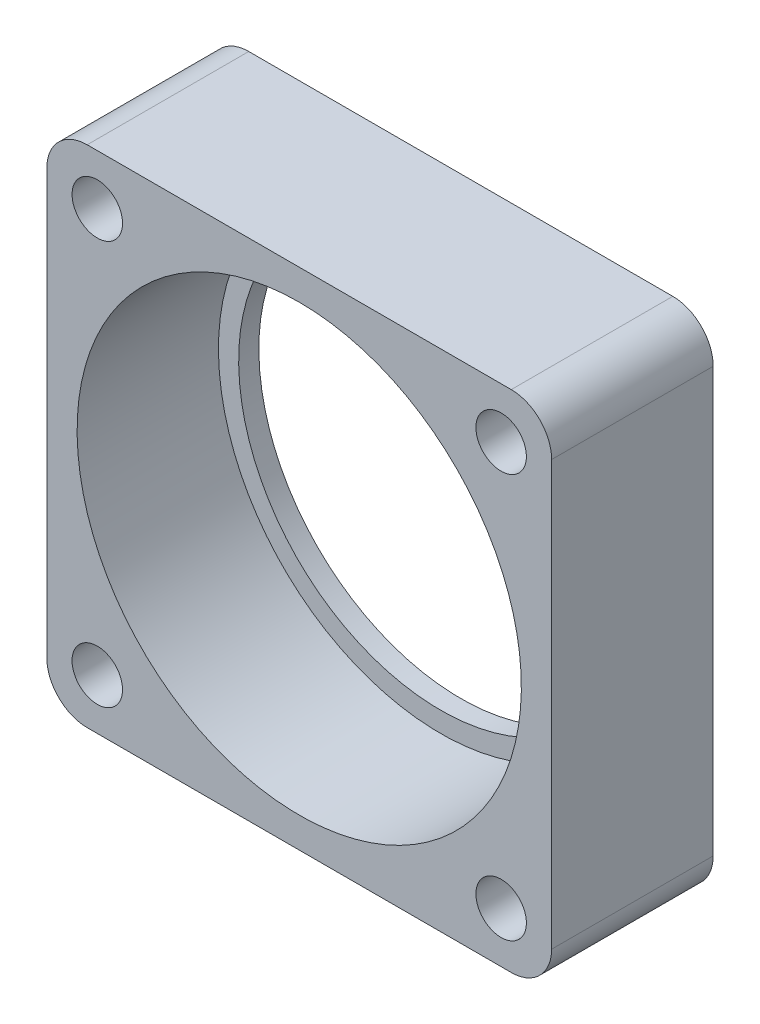
ISO-10303-21;
HEADER;
FILE_DESCRIPTION(('STEP AP214'),'2;1');
FILE_NAME('part.step','',(''),(''),'','','');
FILE_SCHEMA(('AUTOMOTIVE_DESIGN { 1 0 10303 214 1 1 1 1 }'));
ENDSEC;
DATA;
#1=APPLICATION_CONTEXT('core data for automotive mechanical design processes');
#2=APPLICATION_PROTOCOL_DEFINITION('international standard','automotive_design',2000,#1);
#3=PRODUCT_CONTEXT('',#1,'mechanical');
#4=PRODUCT('Part','Part','',(#3));
#5=PRODUCT_RELATED_PRODUCT_CATEGORY('part','',(#4));
#6=PRODUCT_DEFINITION_FORMATION('','',#4);
#7=PRODUCT_DEFINITION_CONTEXT('part definition',#1,'design');
#8=PRODUCT_DEFINITION('design','',#6,#7);
#9=PRODUCT_DEFINITION_SHAPE('','',#8);
#10=(LENGTH_UNIT() NAMED_UNIT(*) SI_UNIT(.MILLI.,.METRE.));
#11=(NAMED_UNIT(*) PLANE_ANGLE_UNIT() SI_UNIT($,.RADIAN.));
#12=(NAMED_UNIT(*) SI_UNIT($,.STERADIAN.) SOLID_ANGLE_UNIT());
#13=UNCERTAINTY_MEASURE_WITH_UNIT(LENGTH_MEASURE(1.E-05),#10,'distance_accuracy_value','');
#14=(GEOMETRIC_REPRESENTATION_CONTEXT(3) GLOBAL_UNCERTAINTY_ASSIGNED_CONTEXT((#13)) GLOBAL_UNIT_ASSIGNED_CONTEXT((#10,
#11,#12)) REPRESENTATION_CONTEXT('',''));
#15=CARTESIAN_POINT('',(0.,0.,0.));
#16=DIRECTION('',(0.,0.,1.));
#17=DIRECTION('',(1.,0.,0.));
#18=AXIS2_PLACEMENT_3D('',#15,#16,#17);
#19=CARTESIAN_POINT('',(0.,0.,8.));
#20=DIRECTION('',(0.,0.,1.));
#21=DIRECTION('',(1.,0.,0.));
#22=AXIS2_PLACEMENT_3D('',#19,#20,#21);
#23=PLANE('',#22);
#24=CARTESIAN_POINT('',(0.,0.,8.));
#25=DIRECTION('',(0.,0.,-1.));
#26=DIRECTION('',(0.,1.,0.));
#27=AXIS2_PLACEMENT_3D('',#24,#25,#26);
#28=CIRCLE('',#27,11.);
#29=CARTESIAN_POINT('',(0.,11.,8.));
#30=VERTEX_POINT('',#29);
#31=EDGE_CURVE('E210',#30,#30,#28,.T.);
#32=ORIENTED_EDGE('',*,*,#31,.T.);
#33=EDGE_LOOP('',(#32));
#34=FACE_BOUND('',#33,.T.);
#35=CARTESIAN_POINT('',(10.,-10.,8.));
#36=DIRECTION('',(0.,0.,1.));
#37=DIRECTION('',(1.,0.,0.));
#38=AXIS2_PLACEMENT_3D('',#35,#36,#37);
#39=CIRCLE('',#38,1.25);
#40=CARTESIAN_POINT('',(11.25,-10.,8.));
#41=VERTEX_POINT('',#40);
#42=EDGE_CURVE('E187',#41,#41,#39,.T.);
#43=ORIENTED_EDGE('',*,*,#42,.F.);
#44=EDGE_LOOP('',(#43));
#45=FACE_BOUND('',#44,.T.);
#46=CARTESIAN_POINT('',(-9.99999999999999,10.,8.));
#47=DIRECTION('',(0.,0.,1.));
#48=DIRECTION('',(1.,0.,0.));
#49=AXIS2_PLACEMENT_3D('',#46,#47,#48);
#50=CIRCLE('',#49,1.25);
#51=CARTESIAN_POINT('',(-8.74999999999999,10.,8.));
#52=VERTEX_POINT('',#51);
#53=EDGE_CURVE('E129',#52,#52,#50,.T.);
#54=ORIENTED_EDGE('',*,*,#53,.F.);
#55=EDGE_LOOP('',(#54));
#56=FACE_BOUND('',#55,.T.);
#57=DIRECTION('',(-1.,0.,0.));
#58=VECTOR('',#57,1.);
#59=CARTESIAN_POINT('',(-12.5,12.5,8.));
#60=LINE('',#59,#58);
#61=CARTESIAN_POINT('',(10.5,12.5,8.));
#62=VERTEX_POINT('',#61);
#63=CARTESIAN_POINT('',(-10.5,12.5,8.));
#64=VERTEX_POINT('',#63);
#65=EDGE_CURVE('E138',#62,#64,#60,.T.);
#66=ORIENTED_EDGE('',*,*,#65,.T.);
#67=CARTESIAN_POINT('',(-10.5,10.5,8.));
#68=DIRECTION('',(0.,0.,1.));
#69=DIRECTION('',(1.,0.,0.));
#70=AXIS2_PLACEMENT_3D('',#67,#68,#69);
#71=CIRCLE('',#70,2.);
#72=CARTESIAN_POINT('',(-12.5,10.5,8.));
#73=VERTEX_POINT('',#72);
#74=EDGE_CURVE('E156',#64,#73,#71,.T.);
#75=ORIENTED_EDGE('',*,*,#74,.T.);
#76=DIRECTION('',(0.,-1.,0.));
#77=VECTOR('',#76,1.);
#78=CARTESIAN_POINT('',(-12.5,12.5,8.));
#79=LINE('',#78,#77);
#80=CARTESIAN_POINT('',(-12.5,-10.5,8.));
#81=VERTEX_POINT('',#80);
#82=EDGE_CURVE('E120',#73,#81,#79,.T.);
#83=ORIENTED_EDGE('',*,*,#82,.T.);
#84=CARTESIAN_POINT('',(-10.5,-10.5,8.));
#85=DIRECTION('',(0.,0.,1.));
#86=DIRECTION('',(1.,0.,0.));
#87=AXIS2_PLACEMENT_3D('',#84,#85,#86);
#88=CIRCLE('',#87,2.);
#89=CARTESIAN_POINT('',(-10.5,-12.5,8.));
#90=VERTEX_POINT('',#89);
#91=EDGE_CURVE('E153',#81,#90,#88,.T.);
#92=ORIENTED_EDGE('',*,*,#91,.T.);
#93=DIRECTION('',(1.,0.,0.));
#94=VECTOR('',#93,1.);
#95=CARTESIAN_POINT('',(-12.5,-12.5,8.));
#96=LINE('',#95,#94);
#97=CARTESIAN_POINT('',(10.5,-12.5,8.));
#98=VERTEX_POINT('',#97);
#99=EDGE_CURVE('E167',#90,#98,#96,.T.);
#100=ORIENTED_EDGE('',*,*,#99,.T.);
#101=CARTESIAN_POINT('',(10.5,-10.5,8.));
#102=DIRECTION('',(0.,0.,1.));
#103=DIRECTION('',(1.,0.,0.));
#104=AXIS2_PLACEMENT_3D('',#101,#102,#103);
#105=CIRCLE('',#104,2.);
#106=CARTESIAN_POINT('',(12.5,-10.5,8.));
#107=VERTEX_POINT('',#106);
#108=EDGE_CURVE('E56',#98,#107,#105,.T.);
#109=ORIENTED_EDGE('',*,*,#108,.T.);
#110=DIRECTION('',(0.,1.,0.));
#111=VECTOR('',#110,1.);
#112=CARTESIAN_POINT('',(12.5,12.5,8.));
#113=LINE('',#112,#111);
#114=CARTESIAN_POINT('',(12.5,10.5,8.));
#115=VERTEX_POINT('',#114);
#116=EDGE_CURVE('E175',#107,#115,#113,.T.);
#117=ORIENTED_EDGE('',*,*,#116,.T.);
#118=CARTESIAN_POINT('',(10.5,10.5,8.));
#119=DIRECTION('',(0.,0.,1.));
#120=DIRECTION('',(1.,0.,0.));
#121=AXIS2_PLACEMENT_3D('',#118,#119,#120);
#122=CIRCLE('',#121,2.);
#123=EDGE_CURVE('E151',#115,#62,#122,.T.);
#124=ORIENTED_EDGE('',*,*,#123,.T.);
#125=EDGE_LOOP('',(#66,#75,#83,#92,#100,#109,#117,#124));
#126=FACE_BOUND('',#125,.T.);
#127=CARTESIAN_POINT('',(10.,10.,8.));
#128=DIRECTION('',(0.,0.,1.));
#129=DIRECTION('',(-1.,0.,0.));
#130=AXIS2_PLACEMENT_3D('',#127,#128,#129);
#131=CIRCLE('',#130,1.25);
#132=CARTESIAN_POINT('',(8.75000000000001,10.,8.));
#133=VERTEX_POINT('',#132);
#134=EDGE_CURVE('E182',#133,#133,#131,.T.);
#135=ORIENTED_EDGE('',*,*,#134,.F.);
#136=EDGE_LOOP('',(#135));
#137=FACE_BOUND('',#136,.T.);
#138=CARTESIAN_POINT('',(-10.,-10.,8.));
#139=DIRECTION('',(0.,0.,1.));
#140=DIRECTION('',(-1.,0.,0.));
#141=AXIS2_PLACEMENT_3D('',#138,#139,#140);
#142=CIRCLE('',#141,1.25);
#143=CARTESIAN_POINT('',(-11.25,-10.,8.));
#144=VERTEX_POINT('',#143);
#145=EDGE_CURVE('E193',#144,#144,#142,.T.);
#146=ORIENTED_EDGE('',*,*,#145,.F.);
#147=EDGE_LOOP('',(#146));
#148=FACE_BOUND('',#147,.T.);
#149=ADVANCED_FACE('F34',(#34,#45,#56,#126,#137,#148),#23,.T.);
#150=CARTESIAN_POINT('',(0.,0.,0.));
#151=DIRECTION('',(0.,0.,1.));
#152=DIRECTION('',(1.,0.,0.));
#153=AXIS2_PLACEMENT_3D('',#150,#151,#152);
#154=PLANE('',#153);
#155=CARTESIAN_POINT('',(0.,0.,0.));
#156=DIRECTION('',(0.,0.,-1.));
#157=DIRECTION('',(0.,1.,0.));
#158=AXIS2_PLACEMENT_3D('',#155,#156,#157);
#159=CIRCLE('',#158,9.99999999999999);
#160=CARTESIAN_POINT('',(0.,10.,0.));
#161=VERTEX_POINT('',#160);
#162=EDGE_CURVE('E199',#161,#161,#159,.T.);
#163=ORIENTED_EDGE('',*,*,#162,.F.);
#164=EDGE_LOOP('',(#163));
#165=FACE_BOUND('',#164,.T.);
#166=CARTESIAN_POINT('',(10.,-10.,0.));
#167=DIRECTION('',(0.,0.,1.));
#168=DIRECTION('',(1.,0.,0.));
#169=AXIS2_PLACEMENT_3D('',#166,#167,#168);
#170=CIRCLE('',#169,1.25);
#171=CARTESIAN_POINT('',(11.25,-10.,0.));
#172=VERTEX_POINT('',#171);
#173=EDGE_CURVE('E190',#172,#172,#170,.T.);
#174=ORIENTED_EDGE('',*,*,#173,.T.);
#175=EDGE_LOOP('',(#174));
#176=FACE_BOUND('',#175,.T.);
#177=CARTESIAN_POINT('',(-9.99999999999999,10.,0.));
#178=DIRECTION('',(0.,0.,1.));
#179=DIRECTION('',(1.,0.,0.));
#180=AXIS2_PLACEMENT_3D('',#177,#178,#179);
#181=CIRCLE('',#180,1.25);
#182=CARTESIAN_POINT('',(-8.74999999999999,10.,0.));
#183=VERTEX_POINT('',#182);
#184=EDGE_CURVE('E135',#183,#183,#181,.T.);
#185=ORIENTED_EDGE('',*,*,#184,.T.);
#186=EDGE_LOOP('',(#185));
#187=FACE_BOUND('',#186,.T.);
#188=DIRECTION('',(0.,-1.,0.));
#189=VECTOR('',#188,1.);
#190=CARTESIAN_POINT('',(-12.5,12.5,0.));
#191=LINE('',#190,#189);
#192=CARTESIAN_POINT('',(-12.5,10.5,0.));
#193=VERTEX_POINT('',#192);
#194=CARTESIAN_POINT('',(-12.5,-10.5,0.));
#195=VERTEX_POINT('',#194);
#196=EDGE_CURVE('E117',#193,#195,#191,.T.);
#197=ORIENTED_EDGE('',*,*,#196,.F.);
#198=CARTESIAN_POINT('',(-10.5,10.5,0.));
#199=DIRECTION('',(0.,0.,1.));
#200=DIRECTION('',(1.,0.,0.));
#201=AXIS2_PLACEMENT_3D('',#198,#199,#200);
#202=CIRCLE('',#201,2.);
#203=CARTESIAN_POINT('',(-10.5,12.5,0.));
#204=VERTEX_POINT('',#203);
#205=EDGE_CURVE('E100',#193,#204,#202,.F.);
#206=ORIENTED_EDGE('',*,*,#205,.T.);
#207=DIRECTION('',(-1.,0.,0.));
#208=VECTOR('',#207,1.);
#209=CARTESIAN_POINT('',(-12.5,12.5,0.));
#210=LINE('',#209,#208);
#211=CARTESIAN_POINT('',(10.5,12.5,0.));
#212=VERTEX_POINT('',#211);
#213=EDGE_CURVE('E142',#212,#204,#210,.T.);
#214=ORIENTED_EDGE('',*,*,#213,.F.);
#215=CARTESIAN_POINT('',(10.5,10.5,0.));
#216=DIRECTION('',(0.,0.,1.));
#217=DIRECTION('',(1.,0.,0.));
#218=AXIS2_PLACEMENT_3D('',#215,#216,#217);
#219=CIRCLE('',#218,2.);
#220=CARTESIAN_POINT('',(12.5,10.5,0.));
#221=VERTEX_POINT('',#220);
#222=EDGE_CURVE('E121',#212,#221,#219,.F.);
#223=ORIENTED_EDGE('',*,*,#222,.T.);
#224=DIRECTION('',(0.,1.,0.));
#225=VECTOR('',#224,1.);
#226=CARTESIAN_POINT('',(12.5,12.5,0.));
#227=LINE('',#226,#225);
#228=CARTESIAN_POINT('',(12.5,-10.5,0.));
#229=VERTEX_POINT('',#228);
#230=EDGE_CURVE('E132',#229,#221,#227,.T.);
#231=ORIENTED_EDGE('',*,*,#230,.F.);
#232=CARTESIAN_POINT('',(10.5,-10.5,0.));
#233=DIRECTION('',(0.,0.,1.));
#234=DIRECTION('',(1.,0.,0.));
#235=AXIS2_PLACEMENT_3D('',#232,#233,#234);
#236=CIRCLE('',#235,2.);
#237=CARTESIAN_POINT('',(10.5,-12.5,0.));
#238=VERTEX_POINT('',#237);
#239=EDGE_CURVE('E111',#229,#238,#236,.F.);
#240=ORIENTED_EDGE('',*,*,#239,.T.);
#241=DIRECTION('',(1.,0.,0.));
#242=VECTOR('',#241,1.);
#243=CARTESIAN_POINT('',(-12.5,-12.5,0.));
#244=LINE('',#243,#242);
#245=CARTESIAN_POINT('',(-10.5,-12.5,0.));
#246=VERTEX_POINT('',#245);
#247=EDGE_CURVE('E128',#246,#238,#244,.T.);
#248=ORIENTED_EDGE('',*,*,#247,.F.);
#249=CARTESIAN_POINT('',(-10.5,-10.5,0.));
#250=DIRECTION('',(0.,0.,1.));
#251=DIRECTION('',(1.,0.,0.));
#252=AXIS2_PLACEMENT_3D('',#249,#250,#251);
#253=CIRCLE('',#252,2.);
#254=EDGE_CURVE('E127',#246,#195,#253,.F.);
#255=ORIENTED_EDGE('',*,*,#254,.T.);
#256=EDGE_LOOP('',(#197,#206,#214,#223,#231,#240,#248,#255));
#257=FACE_BOUND('',#256,.T.);
#258=CARTESIAN_POINT('',(10.,10.,0.));
#259=DIRECTION('',(0.,0.,1.));
#260=DIRECTION('',(-1.,0.,0.));
#261=AXIS2_PLACEMENT_3D('',#258,#259,#260);
#262=CIRCLE('',#261,1.25);
#263=CARTESIAN_POINT('',(8.75000000000001,10.,0.));
#264=VERTEX_POINT('',#263);
#265=EDGE_CURVE('E184',#264,#264,#262,.T.);
#266=ORIENTED_EDGE('',*,*,#265,.T.);
#267=EDGE_LOOP('',(#266));
#268=FACE_BOUND('',#267,.T.);
#269=CARTESIAN_POINT('',(-10.,-10.,0.));
#270=DIRECTION('',(0.,0.,1.));
#271=DIRECTION('',(-1.,0.,0.));
#272=AXIS2_PLACEMENT_3D('',#269,#270,#271);
#273=CIRCLE('',#272,1.25);
#274=CARTESIAN_POINT('',(-11.25,-10.,0.));
#275=VERTEX_POINT('',#274);
#276=EDGE_CURVE('E196',#275,#275,#273,.T.);
#277=ORIENTED_EDGE('',*,*,#276,.T.);
#278=EDGE_LOOP('',(#277));
#279=FACE_BOUND('',#278,.T.);
#280=ADVANCED_FACE('F124',(#165,#176,#187,#257,#268,#279),#154,.F.);
#281=CARTESIAN_POINT('',(-12.5,12.5,8.));
#282=DIRECTION('',(1.,0.,0.));
#283=DIRECTION('',(0.,1.,0.));
#284=AXIS2_PLACEMENT_3D('',#281,#282,#283);
#285=PLANE('',#284);
#286=ORIENTED_EDGE('',*,*,#82,.F.);
#287=DIRECTION('',(0.,0.,-1.));
#288=VECTOR('',#287,1.);
#289=CARTESIAN_POINT('',(-12.5,10.5,8.));
#290=LINE('',#289,#288);
#291=EDGE_CURVE('E104',#73,#193,#290,.T.);
#292=ORIENTED_EDGE('',*,*,#291,.T.);
#293=ORIENTED_EDGE('',*,*,#196,.T.);
#294=DIRECTION('',(0.,0.,-1.));
#295=VECTOR('',#294,1.);
#296=CARTESIAN_POINT('',(-12.5,-10.5,8.));
#297=LINE('',#296,#295);
#298=EDGE_CURVE('E122',#195,#81,#297,.F.);
#299=ORIENTED_EDGE('',*,*,#298,.T.);
#300=EDGE_LOOP('',(#286,#292,#293,#299));
#301=FACE_BOUND('',#300,.T.);
#302=ADVANCED_FACE('F116',(#301),#285,.F.);
#303=CARTESIAN_POINT('',(-12.5,-12.5,8.));
#304=DIRECTION('',(0.,1.,0.));
#305=DIRECTION('',(-1.,0.,0.));
#306=AXIS2_PLACEMENT_3D('',#303,#304,#305);
#307=PLANE('',#306);
#308=ORIENTED_EDGE('',*,*,#247,.T.);
#309=DIRECTION('',(0.,0.,-1.));
#310=VECTOR('',#309,1.);
#311=CARTESIAN_POINT('',(10.5,-12.5,8.));
#312=LINE('',#311,#310);
#313=EDGE_CURVE('E11',#238,#98,#312,.F.);
#314=ORIENTED_EDGE('',*,*,#313,.T.);
#315=ORIENTED_EDGE('',*,*,#99,.F.);
#316=DIRECTION('',(0.,0.,-1.));
#317=VECTOR('',#316,1.);
#318=CARTESIAN_POINT('',(-10.5,-12.5,8.));
#319=LINE('',#318,#317);
#320=EDGE_CURVE('E42',#90,#246,#319,.T.);
#321=ORIENTED_EDGE('',*,*,#320,.T.);
#322=EDGE_LOOP('',(#308,#314,#315,#321));
#323=FACE_BOUND('',#322,.T.);
#324=ADVANCED_FACE('F165',(#323),#307,.F.);
#325=CARTESIAN_POINT('',(12.5,12.5,8.));
#326=DIRECTION('',(-1.,0.,0.));
#327=DIRECTION('',(0.,-1.,0.));
#328=AXIS2_PLACEMENT_3D('',#325,#326,#327);
#329=PLANE('',#328);
#330=ORIENTED_EDGE('',*,*,#116,.F.);
#331=DIRECTION('',(0.,0.,-1.));
#332=VECTOR('',#331,1.);
#333=CARTESIAN_POINT('',(12.5,-10.5,8.));
#334=LINE('',#333,#332);
#335=EDGE_CURVE('E159',#107,#229,#334,.T.);
#336=ORIENTED_EDGE('',*,*,#335,.T.);
#337=ORIENTED_EDGE('',*,*,#230,.T.);
#338=DIRECTION('',(0.,0.,-1.));
#339=VECTOR('',#338,1.);
#340=CARTESIAN_POINT('',(12.5,10.5,8.));
#341=LINE('',#340,#339);
#342=EDGE_CURVE('E49',#221,#115,#341,.F.);
#343=ORIENTED_EDGE('',*,*,#342,.T.);
#344=EDGE_LOOP('',(#330,#336,#337,#343));
#345=FACE_BOUND('',#344,.T.);
#346=ADVANCED_FACE('F174',(#345),#329,.F.);
#347=CARTESIAN_POINT('',(-12.5,12.5,8.));
#348=DIRECTION('',(0.,-1.,0.));
#349=DIRECTION('',(1.,0.,0.));
#350=AXIS2_PLACEMENT_3D('',#347,#348,#349);
#351=PLANE('',#350);
#352=ORIENTED_EDGE('',*,*,#213,.T.);
#353=DIRECTION('',(0.,0.,-1.));
#354=VECTOR('',#353,1.);
#355=CARTESIAN_POINT('',(-10.5,12.5,8.));
#356=LINE('',#355,#354);
#357=EDGE_CURVE('E105',#204,#64,#356,.F.);
#358=ORIENTED_EDGE('',*,*,#357,.T.);
#359=ORIENTED_EDGE('',*,*,#65,.F.);
#360=DIRECTION('',(0.,0.,-1.));
#361=VECTOR('',#360,1.);
#362=CARTESIAN_POINT('',(10.5,12.5,8.));
#363=LINE('',#362,#361);
#364=EDGE_CURVE('E110',#62,#212,#363,.T.);
#365=ORIENTED_EDGE('',*,*,#364,.T.);
#366=EDGE_LOOP('',(#352,#358,#359,#365));
#367=FACE_BOUND('',#366,.T.);
#368=ADVANCED_FACE('F245',(#367),#351,.F.);
#369=CARTESIAN_POINT('',(-9.99999999999999,10.,8.));
#370=DIRECTION('',(0.,0.,-1.));
#371=DIRECTION('',(-1.,0.,0.));
#372=AXIS2_PLACEMENT_3D('',#369,#370,#371);
#373=CYLINDRICAL_SURFACE('',#372,1.25);
#374=ORIENTED_EDGE('',*,*,#53,.T.);
#375=EDGE_LOOP('',(#374));
#376=FACE_BOUND('',#375,.T.);
#377=ORIENTED_EDGE('',*,*,#184,.F.);
#378=EDGE_LOOP('',(#377));
#379=FACE_BOUND('',#378,.T.);
#380=ADVANCED_FACE('F242',(#376,#379),#373,.F.);
#381=CARTESIAN_POINT('',(10.,10.,8.));
#382=DIRECTION('',(0.,0.,-1.));
#383=DIRECTION('',(-1.,0.,0.));
#384=AXIS2_PLACEMENT_3D('',#381,#382,#383);
#385=CYLINDRICAL_SURFACE('',#384,1.25);
#386=ORIENTED_EDGE('',*,*,#134,.T.);
#387=EDGE_LOOP('',(#386));
#388=FACE_BOUND('',#387,.T.);
#389=ORIENTED_EDGE('',*,*,#265,.F.);
#390=EDGE_LOOP('',(#389));
#391=FACE_BOUND('',#390,.T.);
#392=ADVANCED_FACE('F244',(#388,#391),#385,.F.);
#393=CARTESIAN_POINT('',(10.,-10.,8.));
#394=DIRECTION('',(0.,0.,-1.));
#395=DIRECTION('',(-1.,0.,0.));
#396=AXIS2_PLACEMENT_3D('',#393,#394,#395);
#397=CYLINDRICAL_SURFACE('',#396,1.25);
#398=ORIENTED_EDGE('',*,*,#42,.T.);
#399=EDGE_LOOP('',(#398));
#400=FACE_BOUND('',#399,.T.);
#401=ORIENTED_EDGE('',*,*,#173,.F.);
#402=EDGE_LOOP('',(#401));
#403=FACE_BOUND('',#402,.T.);
#404=ADVANCED_FACE('F252',(#400,#403),#397,.F.);
#405=CARTESIAN_POINT('',(-10.,-10.,8.));
#406=DIRECTION('',(0.,0.,-1.));
#407=DIRECTION('',(-1.,0.,0.));
#408=AXIS2_PLACEMENT_3D('',#405,#406,#407);
#409=CYLINDRICAL_SURFACE('',#408,1.25);
#410=ORIENTED_EDGE('',*,*,#145,.T.);
#411=EDGE_LOOP('',(#410));
#412=FACE_BOUND('',#411,.T.);
#413=ORIENTED_EDGE('',*,*,#276,.F.);
#414=EDGE_LOOP('',(#413));
#415=FACE_BOUND('',#414,.T.);
#416=ADVANCED_FACE('F231',(#412,#415),#409,.F.);
#417=CARTESIAN_POINT('',(0.,0.,8.));
#418=DIRECTION('',(0.,0.,-1.));
#419=DIRECTION('',(0.,1.,0.));
#420=AXIS2_PLACEMENT_3D('',#417,#418,#419);
#421=CYLINDRICAL_SURFACE('',#420,10.);
#422=CARTESIAN_POINT('',(0.,0.,0.999999999999997));
#423=DIRECTION('',(0.,0.,-1.));
#424=DIRECTION('',(0.,1.,0.));
#425=AXIS2_PLACEMENT_3D('',#422,#423,#424);
#426=CIRCLE('',#425,10.);
#427=CARTESIAN_POINT('',(0.,10.,1.));
#428=VERTEX_POINT('',#427);
#429=EDGE_CURVE('E204',#428,#428,#426,.T.);
#430=ORIENTED_EDGE('',*,*,#429,.F.);
#431=EDGE_LOOP('',(#430));
#432=FACE_BOUND('',#431,.T.);
#433=ORIENTED_EDGE('',*,*,#162,.T.);
#434=EDGE_LOOP('',(#433));
#435=FACE_BOUND('',#434,.T.);
#436=ADVANCED_FACE('F225',(#432,#435),#421,.F.);
#437=CARTESIAN_POINT('',(0.,10.,1.));
#438=DIRECTION('',(0.,0.,-1.));
#439=DIRECTION('',(0.,1.,0.));
#440=AXIS2_PLACEMENT_3D('',#437,#438,#439);
#441=PLANE('',#440);
#442=CARTESIAN_POINT('',(0.,0.,0.999999999999997));
#443=DIRECTION('',(0.,0.,-1.));
#444=DIRECTION('',(0.,1.,0.));
#445=AXIS2_PLACEMENT_3D('',#442,#443,#444);
#446=CIRCLE('',#445,11.);
#447=CARTESIAN_POINT('',(0.,11.,1.));
#448=VERTEX_POINT('',#447);
#449=EDGE_CURVE('E207',#448,#448,#446,.T.);
#450=ORIENTED_EDGE('',*,*,#449,.F.);
#451=EDGE_LOOP('',(#450));
#452=FACE_BOUND('',#451,.T.);
#453=ORIENTED_EDGE('',*,*,#429,.T.);
#454=EDGE_LOOP('',(#453));
#455=FACE_BOUND('',#454,.T.);
#456=ADVANCED_FACE('F219',(#452,#455),#441,.F.);
#457=CARTESIAN_POINT('',(0.,0.,8.));
#458=DIRECTION('',(0.,0.,-1.));
#459=DIRECTION('',(0.,1.,0.));
#460=AXIS2_PLACEMENT_3D('',#457,#458,#459);
#461=CYLINDRICAL_SURFACE('',#460,11.);
#462=ORIENTED_EDGE('',*,*,#31,.F.);
#463=EDGE_LOOP('',(#462));
#464=FACE_BOUND('',#463,.T.);
#465=ORIENTED_EDGE('',*,*,#449,.T.);
#466=EDGE_LOOP('',(#465));
#467=FACE_BOUND('',#466,.T.);
#468=ADVANCED_FACE('F216',(#464,#467),#461,.F.);
#469=CARTESIAN_POINT('',(-10.5,10.5,8.));
#470=DIRECTION('',(0.,0.,-1.));
#471=DIRECTION('',(-1.,0.,0.));
#472=AXIS2_PLACEMENT_3D('',#469,#470,#471);
#473=CYLINDRICAL_SURFACE('',#472,2.);
#474=ORIENTED_EDGE('',*,*,#74,.F.);
#475=ORIENTED_EDGE('',*,*,#357,.F.);
#476=ORIENTED_EDGE('',*,*,#205,.F.);
#477=ORIENTED_EDGE('',*,*,#291,.F.);
#478=EDGE_LOOP('',(#474,#475,#476,#477));
#479=FACE_BOUND('',#478,.T.);
#480=ADVANCED_FACE('F103',(#479),#473,.T.);
#481=CARTESIAN_POINT('',(10.5,-10.5,8.));
#482=DIRECTION('',(0.,0.,-1.));
#483=DIRECTION('',(-1.,0.,0.));
#484=AXIS2_PLACEMENT_3D('',#481,#482,#483);
#485=CYLINDRICAL_SURFACE('',#484,2.);
#486=ORIENTED_EDGE('',*,*,#108,.F.);
#487=ORIENTED_EDGE('',*,*,#313,.F.);
#488=ORIENTED_EDGE('',*,*,#239,.F.);
#489=ORIENTED_EDGE('',*,*,#335,.F.);
#490=EDGE_LOOP('',(#486,#487,#488,#489));
#491=FACE_BOUND('',#490,.T.);
#492=ADVANCED_FACE('F173',(#491),#485,.T.);
#493=CARTESIAN_POINT('',(-10.5,-10.5,8.));
#494=DIRECTION('',(0.,0.,-1.));
#495=DIRECTION('',(-1.,0.,0.));
#496=AXIS2_PLACEMENT_3D('',#493,#494,#495);
#497=CYLINDRICAL_SURFACE('',#496,2.);
#498=ORIENTED_EDGE('',*,*,#91,.F.);
#499=ORIENTED_EDGE('',*,*,#298,.F.);
#500=ORIENTED_EDGE('',*,*,#254,.F.);
#501=ORIENTED_EDGE('',*,*,#320,.F.);
#502=EDGE_LOOP('',(#498,#499,#500,#501));
#503=FACE_BOUND('',#502,.T.);
#504=ADVANCED_FACE('F271',(#503),#497,.T.);
#505=CARTESIAN_POINT('',(10.5,10.5,8.));
#506=DIRECTION('',(0.,0.,-1.));
#507=DIRECTION('',(-1.,0.,0.));
#508=AXIS2_PLACEMENT_3D('',#505,#506,#507);
#509=CYLINDRICAL_SURFACE('',#508,2.);
#510=ORIENTED_EDGE('',*,*,#123,.F.);
#511=ORIENTED_EDGE('',*,*,#342,.F.);
#512=ORIENTED_EDGE('',*,*,#222,.F.);
#513=ORIENTED_EDGE('',*,*,#364,.F.);
#514=EDGE_LOOP('',(#510,#511,#512,#513));
#515=FACE_BOUND('',#514,.T.);
#516=ADVANCED_FACE('F36',(#515),#509,.T.);
#517=CLOSED_SHELL('',(#149,#280,#302,#324,#346,#368,#380,#392,#404,#416,#436,#456,#468,#480,
#492,#504,#516));
#518=MANIFOLD_SOLID_BREP('B2',#517);
#519=ADVANCED_BREP_SHAPE_REPRESENTATION('',(#18,#518),#14);
#520=SHAPE_DEFINITION_REPRESENTATION(#9,#519);
ENDSEC;
END-ISO-10303-21;
